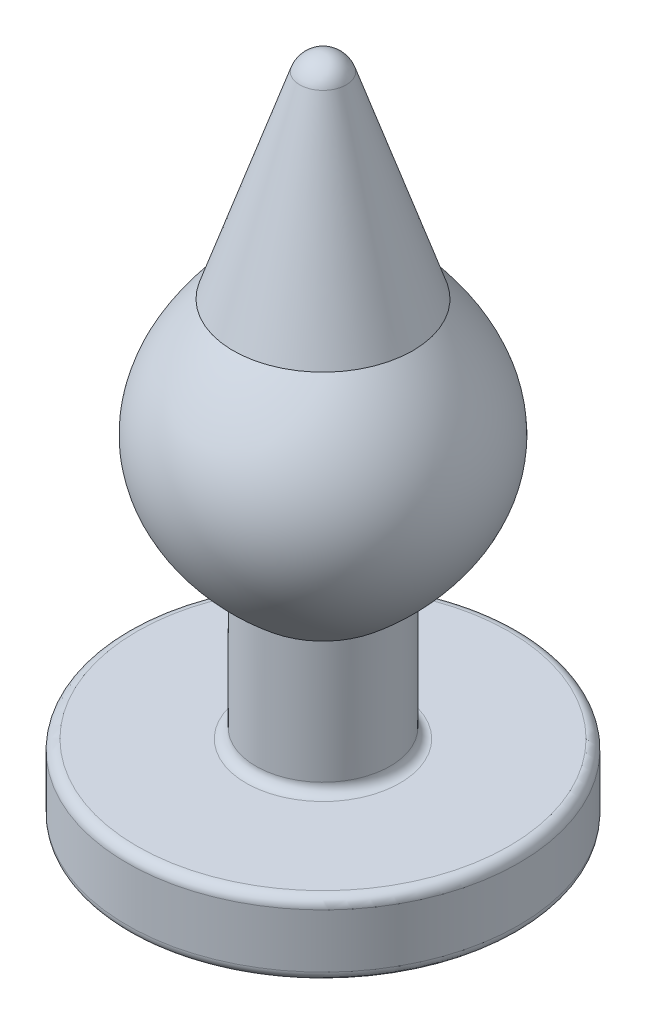
ISO-10303-21;
HEADER;
FILE_DESCRIPTION(('STEP AP214'),'2;1');
FILE_NAME('part.step','',(''),(''),'','','');
FILE_SCHEMA(('AUTOMOTIVE_DESIGN { 1 0 10303 214 1 1 1 1 }'));
ENDSEC;
DATA;
#1=APPLICATION_CONTEXT('core data for automotive mechanical design processes');
#2=APPLICATION_PROTOCOL_DEFINITION('international standard','automotive_design',2000,#1);
#3=PRODUCT_CONTEXT('',#1,'mechanical');
#4=PRODUCT('Part','Part','',(#3));
#5=PRODUCT_RELATED_PRODUCT_CATEGORY('part','',(#4));
#6=PRODUCT_DEFINITION_FORMATION('','',#4);
#7=PRODUCT_DEFINITION_CONTEXT('part definition',#1,'design');
#8=PRODUCT_DEFINITION('design','',#6,#7);
#9=PRODUCT_DEFINITION_SHAPE('','',#8);
#10=(LENGTH_UNIT() NAMED_UNIT(*) SI_UNIT(.MILLI.,.METRE.));
#11=(NAMED_UNIT(*) PLANE_ANGLE_UNIT() SI_UNIT($,.RADIAN.));
#12=(NAMED_UNIT(*) SI_UNIT($,.STERADIAN.) SOLID_ANGLE_UNIT());
#13=UNCERTAINTY_MEASURE_WITH_UNIT(LENGTH_MEASURE(1.E-05),#10,'distance_accuracy_value','');
#14=(GEOMETRIC_REPRESENTATION_CONTEXT(3) GLOBAL_UNCERTAINTY_ASSIGNED_CONTEXT((#13)) GLOBAL_UNIT_ASSIGNED_CONTEXT((#10,
#11,#12)) REPRESENTATION_CONTEXT('',''));
#15=CARTESIAN_POINT('',(0.,0.,0.));
#16=DIRECTION('',(0.,0.,1.));
#17=DIRECTION('',(1.,0.,0.));
#18=AXIS2_PLACEMENT_3D('',#15,#16,#17);
#19=CARTESIAN_POINT('',(0.,41.7337945649432,0.));
#20=DIRECTION('',(0.,1.,0.));
#21=DIRECTION('',(1.,0.,0.));
#22=AXIS2_PLACEMENT_3D('',#19,#20,#21);
#23=SPHERICAL_SURFACE('',#22,3.175);
#24=CARTESIAN_POINT('',(0.,42.7517361579674,0.));
#25=DIRECTION('',(0.,1.,0.));
#26=DIRECTION('',(-1.,0.,0.));
#27=AXIS2_PLACEMENT_3D('',#24,#25,#26);
#28=CIRCLE('',#27,3.00739420648361);
#29=CARTESIAN_POINT('',(3.00739420648359,42.7517361579674,0.));
#30=VERTEX_POINT('',#29);
#31=EDGE_CURVE('E66',#30,#30,#28,.T.);
#32=ORIENTED_EDGE('',*,*,#31,.T.);
#33=EDGE_LOOP('',(#32));
#34=FACE_BOUND('',#33,.T.);
#35=ADVANCED_FACE('F35',(#34),#23,.T.);
#36=CARTESIAN_POINT('',(0.,-41.7337945649432,0.));
#37=DIRECTION('',(0.,1.,0.));
#38=DIRECTION('',(-1.,0.,0.));
#39=AXIS2_PLACEMENT_3D('',#36,#37,#38);
#40=PLANE('',#39);
#41=CARTESIAN_POINT('',(0.,-41.7337945649432,0.));
#42=DIRECTION('',(0.,1.,0.));
#43=DIRECTION('',(-1.,0.,0.));
#44=AXIS2_PLACEMENT_3D('',#41,#42,#43);
#45=CIRCLE('',#44,24.13);
#46=CARTESIAN_POINT('',(-24.13,-41.7337945649432,0.));
#47=VERTEX_POINT('',#46);
#48=EDGE_CURVE('E10',#47,#47,#45,.T.);
#49=ORIENTED_EDGE('',*,*,#48,.F.);
#50=EDGE_LOOP('',(#49));
#51=FACE_BOUND('',#50,.T.);
#52=ADVANCED_FACE('F104',(#51),#40,.F.);
#53=CARTESIAN_POINT('',(0.,-40.4637945649432,0.));
#54=DIRECTION('',(0.,1.,0.));
#55=DIRECTION('',(-1.,0.,0.));
#56=AXIS2_PLACEMENT_3D('',#53,#54,#55);
#57=TOROIDAL_SURFACE('',#56,24.13,1.27);
#58=CARTESIAN_POINT('',(0.,-40.4637945649432,0.));
#59=DIRECTION('',(0.,1.,0.));
#60=DIRECTION('',(-1.,0.,0.));
#61=AXIS2_PLACEMENT_3D('',#58,#59,#60);
#62=CIRCLE('',#61,25.4);
#63=CARTESIAN_POINT('',(-25.4,-40.4637945649432,0.));
#64=VERTEX_POINT('',#63);
#65=EDGE_CURVE('E41',#64,#64,#62,.T.);
#66=ORIENTED_EDGE('',*,*,#65,.F.);
#67=EDGE_LOOP('',(#66));
#68=FACE_BOUND('',#67,.T.);
#69=ORIENTED_EDGE('',*,*,#48,.T.);
#70=EDGE_LOOP('',(#69));
#71=FACE_BOUND('',#70,.T.);
#72=ADVANCED_FACE('F101',(#68,#71),#57,.T.);
#73=CARTESIAN_POINT('',(0.,44.9087945649432,0.));
#74=DIRECTION('',(0.,1.,0.));
#75=DIRECTION('',(-1.,0.,0.));
#76=AXIS2_PLACEMENT_3D('',#73,#74,#75);
#77=CYLINDRICAL_SURFACE('',#76,25.4);
#78=CARTESIAN_POINT('',(0.,-33.4787945649432,0.));
#79=DIRECTION('',(0.,1.,0.));
#80=DIRECTION('',(-1.,0.,0.));
#81=AXIS2_PLACEMENT_3D('',#78,#79,#80);
#82=CIRCLE('',#81,25.4);
#83=CARTESIAN_POINT('',(-25.4,-33.4787945649432,0.));
#84=VERTEX_POINT('',#83);
#85=EDGE_CURVE('E45',#84,#84,#82,.T.);
#86=ORIENTED_EDGE('',*,*,#85,.F.);
#87=EDGE_LOOP('',(#86));
#88=FACE_BOUND('',#87,.T.);
#89=ORIENTED_EDGE('',*,*,#65,.T.);
#90=EDGE_LOOP('',(#89));
#91=FACE_BOUND('',#90,.T.);
#92=ADVANCED_FACE('F97',(#88,#91),#77,.T.);
#93=CARTESIAN_POINT('',(0.,-33.4787945649432,0.));
#94=DIRECTION('',(0.,1.,0.));
#95=DIRECTION('',(-1.,0.,0.));
#96=AXIS2_PLACEMENT_3D('',#93,#94,#95);
#97=TOROIDAL_SURFACE('',#96,24.13,1.27);
#98=CARTESIAN_POINT('',(0.,-32.2087945649432,0.));
#99=DIRECTION('',(0.,1.,0.));
#100=DIRECTION('',(-1.,0.,0.));
#101=AXIS2_PLACEMENT_3D('',#98,#99,#100);
#102=CIRCLE('',#101,24.13);
#103=CARTESIAN_POINT('',(-24.13,-32.2087945649432,0.));
#104=VERTEX_POINT('',#103);
#105=EDGE_CURVE('E49',#104,#104,#102,.T.);
#106=ORIENTED_EDGE('',*,*,#105,.F.);
#107=EDGE_LOOP('',(#106));
#108=FACE_BOUND('',#107,.T.);
#109=ORIENTED_EDGE('',*,*,#85,.T.);
#110=EDGE_LOOP('',(#109));
#111=FACE_BOUND('',#110,.T.);
#112=ADVANCED_FACE('F93',(#108,#111),#97,.T.);
#113=CARTESIAN_POINT('',(9.97448006788495,-32.2087945649432,0.));
#114=DIRECTION('',(0.,-1.,0.));
#115=DIRECTION('',(1.,0.,0.));
#116=AXIS2_PLACEMENT_3D('',#113,#114,#115);
#117=PLANE('',#116);
#118=CARTESIAN_POINT('',(0.,-32.2087945649432,0.));
#119=DIRECTION('',(0.,1.,0.));
#120=DIRECTION('',(-1.,0.,0.));
#121=AXIS2_PLACEMENT_3D('',#118,#119,#120);
#122=CIRCLE('',#121,9.97448006788495);
#123=CARTESIAN_POINT('',(-9.97448006788496,-32.2087945649432,0.));
#124=VERTEX_POINT('',#123);
#125=EDGE_CURVE('E54',#124,#124,#122,.T.);
#126=ORIENTED_EDGE('',*,*,#125,.F.);
#127=EDGE_LOOP('',(#126));
#128=FACE_BOUND('',#127,.T.);
#129=ORIENTED_EDGE('',*,*,#105,.T.);
#130=EDGE_LOOP('',(#129));
#131=FACE_BOUND('',#130,.T.);
#132=ADVANCED_FACE('F89',(#128,#131),#117,.F.);
#133=CARTESIAN_POINT('',(0.,-30.9387945649432,0.));
#134=DIRECTION('',(0.,1.,0.));
#135=DIRECTION('',(-1.,0.,0.));
#136=AXIS2_PLACEMENT_3D('',#133,#134,#135);
#137=TOROIDAL_SURFACE('',#136,9.97448006788495,1.27);
#138=CARTESIAN_POINT('',(0.,-30.9387945649432,0.));
#139=DIRECTION('',(0.,1.,0.));
#140=DIRECTION('',(-1.,0.,0.));
#141=AXIS2_PLACEMENT_3D('',#138,#139,#140);
#142=CIRCLE('',#141,8.70448006788495);
#143=CARTESIAN_POINT('',(-8.70448006788495,-30.9387945649432,0.));
#144=VERTEX_POINT('',#143);
#145=EDGE_CURVE('E57',#144,#144,#142,.T.);
#146=ORIENTED_EDGE('',*,*,#145,.F.);
#147=EDGE_LOOP('',(#146));
#148=FACE_BOUND('',#147,.T.);
#149=ORIENTED_EDGE('',*,*,#125,.T.);
#150=EDGE_LOOP('',(#149));
#151=FACE_BOUND('',#150,.T.);
#152=ADVANCED_FACE('F85',(#148,#151),#137,.F.);
#153=CARTESIAN_POINT('',(0.,44.9087945649432,0.));
#154=DIRECTION('',(0.,1.,0.));
#155=DIRECTION('',(-1.,0.,0.));
#156=AXIS2_PLACEMENT_3D('',#153,#154,#155);
#157=CYLINDRICAL_SURFACE('',#156,8.70448006788495);
#158=CARTESIAN_POINT('',(0.,-15.0869048557796,0.));
#159=DIRECTION('',(0.,1.,0.));
#160=DIRECTION('',(-1.,0.,0.));
#161=AXIS2_PLACEMENT_3D('',#158,#159,#160);
#162=CIRCLE('',#161,8.70448006788495);
#163=CARTESIAN_POINT('',(-8.70448006788496,-15.0869048557796,0.));
#164=VERTEX_POINT('',#163);
#165=EDGE_CURVE('E60',#164,#164,#162,.T.);
#166=ORIENTED_EDGE('',*,*,#165,.F.);
#167=EDGE_LOOP('',(#166));
#168=FACE_BOUND('',#167,.T.);
#169=ORIENTED_EDGE('',*,*,#145,.T.);
#170=EDGE_LOOP('',(#169));
#171=FACE_BOUND('',#170,.T.);
#172=ADVANCED_FACE('F81',(#168,#171),#157,.T.);
#173=CARTESIAN_POINT('',(8.70448006788495,-15.0869048557796,0.));
#174=CARTESIAN_POINT('',(27.0920477115225,0.077628738188323,0.));
#175=CARTESIAN_POINT('',(11.6521896505068,17.2116581095298,0.));
#176=B_SPLINE_CURVE_WITH_KNOTS('',2,(#173,#174,#175),.UNSPECIFIED.,.F.,.F.,(3,3),(0.,1.),.UNSPECIFIED.);
#177=CARTESIAN_POINT('',(0.,44.9087945649432,0.));
#178=DIRECTION('',(0.,1.,0.));
#179=AXIS1_PLACEMENT('',#177,#178);
#180=SURFACE_OF_REVOLUTION('',#176,#179);
#181=CARTESIAN_POINT('',(0.,17.2116581095298,0.));
#182=DIRECTION('',(0.,1.,0.));
#183=DIRECTION('',(-1.,0.,0.));
#184=AXIS2_PLACEMENT_3D('',#181,#182,#183);
#185=CIRCLE('',#184,11.6521896505068);
#186=CARTESIAN_POINT('',(11.6521896505068,17.2116581095298,0.));
#187=VERTEX_POINT('',#186);
#188=EDGE_CURVE('E63',#187,#187,#185,.T.);
#189=ORIENTED_EDGE('',*,*,#188,.F.);
#190=EDGE_LOOP('',(#189));
#191=FACE_BOUND('',#190,.T.);
#192=ORIENTED_EDGE('',*,*,#165,.T.);
#193=EDGE_LOOP('',(#192));
#194=FACE_BOUND('',#193,.T.);
#195=ADVANCED_FACE('F76',(#191,#194),#180,.T.);
#196=CARTESIAN_POINT('',(0.,17.2116581095298,0.));
#197=DIRECTION('',(0.,-1.,0.));
#198=DIRECTION('',(1.,0.,0.));
#199=AXIS2_PLACEMENT_3D('',#196,#197,#198);
#200=CONICAL_SURFACE('',#199,11.6521896505068,0.326375023240114);
#201=CARTESIAN_POINT('',(3.00739420648359,42.7517361579674,0.));
#202=CARTESIAN_POINT('',(3.0974441590255,42.4856936782962,0.));
#203=CARTESIAN_POINT('',(3.18749411156741,42.219651198625,0.));
#204=CARTESIAN_POINT('',(3.36759401665122,41.6875662392825,0.));
#205=CARTESIAN_POINT('',(3.45764396919313,41.4215237596113,0.));
#206=CARTESIAN_POINT('',(3.63774387427695,40.8894388002689,0.));
#207=CARTESIAN_POINT('',(3.72779382681886,40.6233963205976,0.));
#208=CARTESIAN_POINT('',(3.90789373190267,40.0913113612552,0.));
#209=CARTESIAN_POINT('',(3.99794368444458,39.825268881584,0.));
#210=CARTESIAN_POINT('',(4.1780435895284,39.2931839222415,0.));
#211=CARTESIAN_POINT('',(4.26809354207031,39.0271414425703,0.));
#212=CARTESIAN_POINT('',(4.44819344715413,38.4950564832278,0.));
#213=CARTESIAN_POINT('',(4.53824339969603,38.2290140035566,0.));
#214=CARTESIAN_POINT('',(4.71834330477985,37.6969290442142,0.));
#215=CARTESIAN_POINT('',(4.80839325732176,37.430886564543,0.));
#216=CARTESIAN_POINT('',(4.98849316240558,36.8988016052005,0.));
#217=CARTESIAN_POINT('',(5.07854311494749,36.6327591255293,0.));
#218=CARTESIAN_POINT('',(5.2586430200313,36.1006741661868,0.));
#219=CARTESIAN_POINT('',(5.34869297257321,35.8346316865156,0.));
#220=CARTESIAN_POINT('',(5.52879287765703,35.3025467271731,0.));
#221=CARTESIAN_POINT('',(5.61884283019894,35.0365042475019,0.));
#222=CARTESIAN_POINT('',(5.79894273528275,34.5044192881595,0.));
#223=CARTESIAN_POINT('',(5.88899268782466,34.2383768084882,0.));
#224=CARTESIAN_POINT('',(6.06909259290848,33.7062918491458,0.));
#225=CARTESIAN_POINT('',(6.15914254545039,33.4402493694746,0.));
#226=CARTESIAN_POINT('',(6.33924245053421,32.9081644101321,0.));
#227=CARTESIAN_POINT('',(6.42929240307612,32.6421219304609,0.));
#228=CARTESIAN_POINT('',(6.60939230815993,32.1100369711184,0.));
#229=CARTESIAN_POINT('',(6.69944226070184,31.8439944914472,0.));
#230=CARTESIAN_POINT('',(6.87954216578566,31.3119095321048,0.));
#231=CARTESIAN_POINT('',(6.96959211832757,31.0458670524335,0.));
#232=CARTESIAN_POINT('',(7.14969202341138,30.5137820930911,0.));
#233=CARTESIAN_POINT('',(7.23974197595329,30.2477396134199,0.));
#234=CARTESIAN_POINT('',(7.41984188103711,29.7156546540774,0.));
#235=CARTESIAN_POINT('',(7.50989183357902,29.4496121744062,0.));
#236=CARTESIAN_POINT('',(7.68999173866284,28.9175272150637,0.));
#237=CARTESIAN_POINT('',(7.78004169120474,28.6514847353925,0.));
#238=CARTESIAN_POINT('',(7.96014159628856,28.1193997760501,0.));
#239=CARTESIAN_POINT('',(8.05019154883047,27.8533572963788,0.));
#240=CARTESIAN_POINT('',(8.23029145391429,27.3212723370364,0.));
#241=CARTESIAN_POINT('',(8.3203414064562,27.0552298573652,0.));
#242=CARTESIAN_POINT('',(8.50044131154001,26.5231448980227,0.));
#243=CARTESIAN_POINT('',(8.59049126408192,26.2571024183515,0.));
#244=CARTESIAN_POINT('',(8.77059116916574,25.725017459009,0.));
#245=CARTESIAN_POINT('',(8.86064112170765,25.4589749793378,0.));
#246=CARTESIAN_POINT('',(9.04074102679146,24.9268900199954,0.));
#247=CARTESIAN_POINT('',(9.13079097933337,24.6608475403241,0.));
#248=CARTESIAN_POINT('',(9.31089088441719,24.1287625809817,0.));
#249=CARTESIAN_POINT('',(9.4009408369591,23.8627201013105,0.));
#250=CARTESIAN_POINT('',(9.58104074204292,23.330635141968,0.));
#251=CARTESIAN_POINT('',(9.67109069458483,23.0645926622968,0.));
#252=CARTESIAN_POINT('',(9.85119059966864,22.5325077029543,0.));
#253=CARTESIAN_POINT('',(9.94124055221055,22.2664652232831,0.));
#254=CARTESIAN_POINT('',(10.1213404572944,21.7343802639407,0.));
#255=CARTESIAN_POINT('',(10.2113904098363,21.4683377842694,0.));
#256=CARTESIAN_POINT('',(10.3914903149201,20.936252824927,0.));
#257=CARTESIAN_POINT('',(10.481540267462,20.6702103452558,0.));
#258=CARTESIAN_POINT('',(10.6616401725458,20.1381253859133,0.));
#259=CARTESIAN_POINT('',(10.7516901250877,19.8720829062421,0.));
#260=CARTESIAN_POINT('',(10.9317900301715,19.3399979468996,0.));
#261=CARTESIAN_POINT('',(11.0218399827135,19.0739554672284,0.));
#262=CARTESIAN_POINT('',(11.2019398877973,18.541870507886,0.));
#263=CARTESIAN_POINT('',(11.2919898403392,18.2758280282147,0.));
#264=CARTESIAN_POINT('',(11.472089745423,17.7437430688723,0.));
#265=CARTESIAN_POINT('',(11.5621396979649,17.4777005892011,0.));
#266=CARTESIAN_POINT('',(11.6521896505068,17.2116581095298,0.));
#267=B_SPLINE_CURVE_WITH_KNOTS('',3,(#201,#202,#203,#204,#205,#206,#207,#208,#209,#210,#211,
#212,#213,#214,#215,#216,#217,#218,#219,#220,#221,#222,#223,#224,#225,#226,#227,#228,#229,#230,
#231,#232,#233,#234,#235,#236,#237,#238,#239,#240,#241,#242,#243,#244,#245,#246,#247,#248,#249,
#250,#251,#252,#253,#254,#255,#256,#257,#258,#259,#260,#261,#262,#263,#264,#265,#266),
.UNSPECIFIED.,.F.,.F.,(4,2,2,2,2,2,2,2,2,2,2,2,2,2,2,2,2,2,2,2,2,2,2,2,2,2,2,2,2,2,2,2,4),(0.,
0.842608066945557,1.68521613389111,2.52782420083667,3.37043226778223,4.21304033472778,
5.05564840167334,5.8982564686189,6.74086453556445,7.58347260251001,8.42608066945557,
9.26868873640112,10.1112968033467,10.9539048702922,11.7965129372378,12.6391210041834,
13.4817290711289,14.3243371380745,15.16694520502,16.0095532719656,16.8521613389111,
17.6947694058567,18.5373774728022,19.3799855397478,20.2225936066934,21.0652016736389,
21.9078097405845,22.75041780753,23.5930258744756,24.4356339414212,25.2782420083667,
26.1208500753123,26.9634581422578),.UNSPECIFIED.);
#268=EDGE_CURVE('BSEAM80',#30,#187,#267,.T.);
#269=ORIENTED_EDGE('',*,*,#31,.F.);
#270=ORIENTED_EDGE('',*,*,#188,.T.);
#271=ORIENTED_EDGE('',*,*,#268,.T.);
#272=ORIENTED_EDGE('',*,*,#268,.F.);
#273=EDGE_LOOP('',(#269,#271,#270,#272));
#274=FACE_BOUND('',#273,.T.);
#275=ADVANCED_FACE('F80',(#274),#200,.T.);
#276=CLOSED_SHELL('',(#35,#52,#72,#92,#112,#132,#152,#172,#195,#275));
#277=MANIFOLD_SOLID_BREP('B2',#276);
#278=ADVANCED_BREP_SHAPE_REPRESENTATION('',(#18,#277),#14);
#279=SHAPE_DEFINITION_REPRESENTATION(#9,#278);
ENDSEC;
END-ISO-10303-21;
